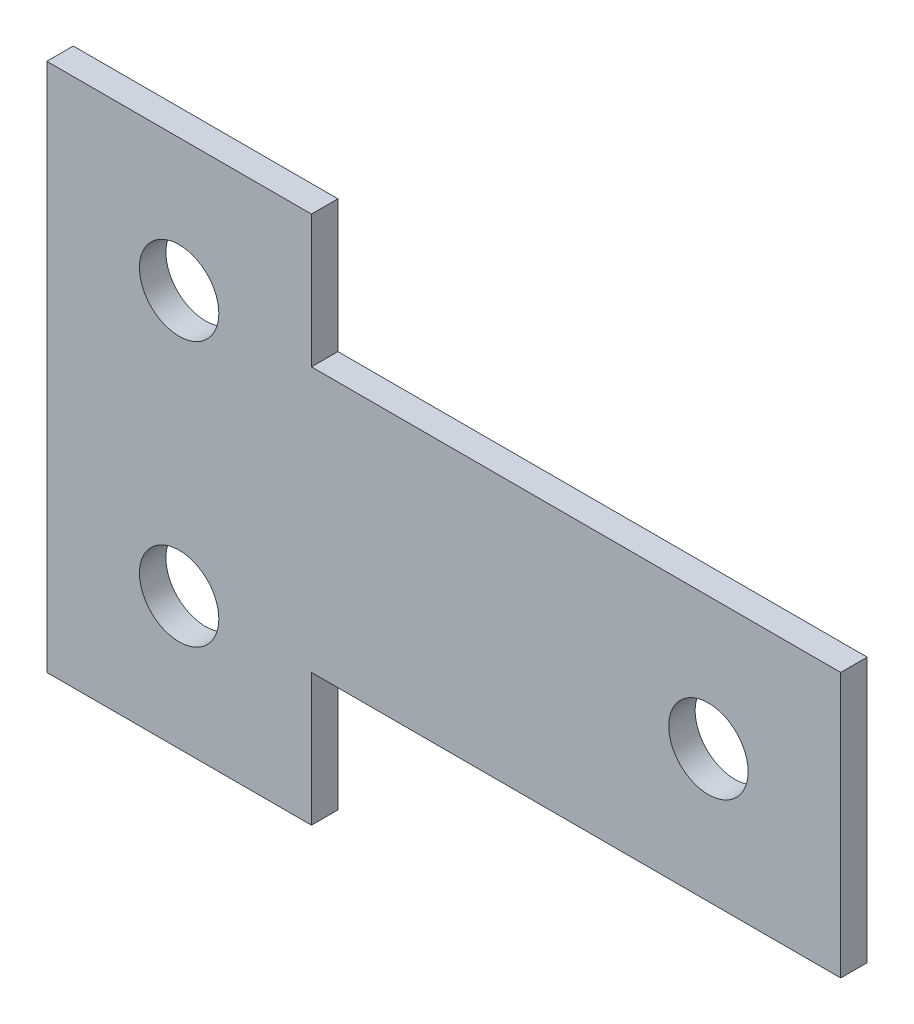
ISO-10303-21;
HEADER;
FILE_DESCRIPTION(('STEP AP214'),'2;1');
FILE_NAME('part.step','',(''),(''),'','','');
FILE_SCHEMA(('AUTOMOTIVE_DESIGN { 1 0 10303 214 1 1 1 1 }'));
ENDSEC;
DATA;
#1=APPLICATION_CONTEXT('core data for automotive mechanical design processes');
#2=APPLICATION_PROTOCOL_DEFINITION('international standard','automotive_design',2000,#1);
#3=PRODUCT_CONTEXT('',#1,'mechanical');
#4=PRODUCT('Part','Part','',(#3));
#5=PRODUCT_RELATED_PRODUCT_CATEGORY('part','',(#4));
#6=PRODUCT_DEFINITION_FORMATION('','',#4);
#7=PRODUCT_DEFINITION_CONTEXT('part definition',#1,'design');
#8=PRODUCT_DEFINITION('design','',#6,#7);
#9=PRODUCT_DEFINITION_SHAPE('','',#8);
#10=(LENGTH_UNIT() NAMED_UNIT(*) SI_UNIT(.MILLI.,.METRE.));
#11=(NAMED_UNIT(*) PLANE_ANGLE_UNIT() SI_UNIT($,.RADIAN.));
#12=(NAMED_UNIT(*) SI_UNIT($,.STERADIAN.) SOLID_ANGLE_UNIT());
#13=UNCERTAINTY_MEASURE_WITH_UNIT(LENGTH_MEASURE(1.E-05),#10,'distance_accuracy_value','');
#14=(GEOMETRIC_REPRESENTATION_CONTEXT(3) GLOBAL_UNCERTAINTY_ASSIGNED_CONTEXT((#13)) GLOBAL_UNIT_ASSIGNED_CONTEXT((#10,
#11,#12)) REPRESENTATION_CONTEXT('',''));
#15=CARTESIAN_POINT('',(0.,0.,0.));
#16=DIRECTION('',(0.,0.,1.));
#17=DIRECTION('',(1.,0.,0.));
#18=AXIS2_PLACEMENT_3D('',#15,#16,#17);
#19=CARTESIAN_POINT('',(0.564500484966157,0.,2.));
#20=DIRECTION('',(1.,0.,0.));
#21=DIRECTION('',(0.,1.,0.));
#22=AXIS2_PLACEMENT_3D('',#19,#20,#21);
#23=PLANE('',#22);
#24=DIRECTION('',(0.,-1.,0.));
#25=VECTOR('',#24,1.);
#26=CARTESIAN_POINT('',(0.564500484966157,0.,0.));
#27=LINE('',#26,#25);
#28=CARTESIAN_POINT('',(0.564500484966153,12.2,0.));
#29=VERTEX_POINT('',#28);
#30=CARTESIAN_POINT('',(0.56450048496616,-7.80000000000003,0.));
#31=VERTEX_POINT('',#30);
#32=EDGE_CURVE('E162',#29,#31,#27,.T.);
#33=ORIENTED_EDGE('',*,*,#32,.F.);
#34=DIRECTION('',(0.,0.,-1.));
#35=VECTOR('',#34,1.);
#36=CARTESIAN_POINT('',(0.564500484966153,12.2,2.));
#37=LINE('',#36,#35);
#38=CARTESIAN_POINT('',(0.564500484966153,12.2,2.));
#39=VERTEX_POINT('',#38);
#40=EDGE_CURVE('E11',#39,#29,#37,.T.);
#41=ORIENTED_EDGE('',*,*,#40,.F.);
#42=DIRECTION('',(0.,-1.,0.));
#43=VECTOR('',#42,1.);
#44=CARTESIAN_POINT('',(0.564500484966157,0.,2.));
#45=LINE('',#44,#43);
#46=CARTESIAN_POINT('',(0.56450048496616,-7.80000000000003,2.));
#47=VERTEX_POINT('',#46);
#48=EDGE_CURVE('E139',#39,#47,#45,.T.);
#49=ORIENTED_EDGE('',*,*,#48,.T.);
#50=DIRECTION('',(0.,0.,-1.));
#51=VECTOR('',#50,1.);
#52=CARTESIAN_POINT('',(0.56450048496616,-7.80000000000003,2.));
#53=LINE('',#52,#51);
#54=EDGE_CURVE('E87',#47,#31,#53,.T.);
#55=ORIENTED_EDGE('',*,*,#54,.T.);
#56=EDGE_LOOP('',(#33,#41,#49,#55));
#57=FACE_BOUND('',#56,.T.);
#58=ADVANCED_FACE('F37',(#57),#23,.T.);
#59=CARTESIAN_POINT('',(0.,12.2,2.));
#60=DIRECTION('',(0.,1.,0.));
#61=DIRECTION('',(0.,0.,1.));
#62=AXIS2_PLACEMENT_3D('',#59,#60,#61);
#63=PLANE('',#62);
#64=DIRECTION('',(1.,0.,0.));
#65=VECTOR('',#64,1.);
#66=CARTESIAN_POINT('',(0.,12.2,0.));
#67=LINE('',#66,#65);
#68=CARTESIAN_POINT('',(-39.4354995150338,12.2,0.));
#69=VERTEX_POINT('',#68);
#70=EDGE_CURVE('E166',#69,#29,#67,.T.);
#71=ORIENTED_EDGE('',*,*,#70,.F.);
#72=DIRECTION('',(0.,0.,-1.));
#73=VECTOR('',#72,1.);
#74=CARTESIAN_POINT('',(-39.4354995150338,12.2,2.));
#75=LINE('',#74,#73);
#76=CARTESIAN_POINT('',(-39.4354995150338,12.2,2.));
#77=VERTEX_POINT('',#76);
#78=EDGE_CURVE('E45',#77,#69,#75,.T.);
#79=ORIENTED_EDGE('',*,*,#78,.F.);
#80=DIRECTION('',(1.,0.,0.));
#81=VECTOR('',#80,1.);
#82=CARTESIAN_POINT('',(0.,12.2,2.));
#83=LINE('',#82,#81);
#84=EDGE_CURVE('E134',#77,#39,#83,.T.);
#85=ORIENTED_EDGE('',*,*,#84,.T.);
#86=ORIENTED_EDGE('',*,*,#40,.T.);
#87=EDGE_LOOP('',(#71,#79,#85,#86));
#88=FACE_BOUND('',#87,.T.);
#89=ADVANCED_FACE('F192',(#88),#63,.T.);
#90=CARTESIAN_POINT('',(-39.4354995150338,0.,2.));
#91=DIRECTION('',(1.,0.,0.));
#92=DIRECTION('',(0.,1.,0.));
#93=AXIS2_PLACEMENT_3D('',#90,#91,#92);
#94=PLANE('',#93);
#95=DIRECTION('',(0.,-1.,0.));
#96=VECTOR('',#95,1.);
#97=CARTESIAN_POINT('',(-39.4354995150338,0.,0.));
#98=LINE('',#97,#96);
#99=CARTESIAN_POINT('',(-39.4354995150339,22.2,0.));
#100=VERTEX_POINT('',#99);
#101=EDGE_CURVE('E170',#100,#69,#98,.T.);
#102=ORIENTED_EDGE('',*,*,#101,.F.);
#103=DIRECTION('',(0.,0.,-1.));
#104=VECTOR('',#103,1.);
#105=CARTESIAN_POINT('',(-39.4354995150339,22.2,2.));
#106=LINE('',#105,#104);
#107=CARTESIAN_POINT('',(-39.4354995150339,22.2,2.));
#108=VERTEX_POINT('',#107);
#109=EDGE_CURVE('E188',#108,#100,#106,.T.);
#110=ORIENTED_EDGE('',*,*,#109,.F.);
#111=DIRECTION('',(0.,-1.,0.));
#112=VECTOR('',#111,1.);
#113=CARTESIAN_POINT('',(-39.4354995150338,0.,2.));
#114=LINE('',#113,#112);
#115=EDGE_CURVE('E128',#108,#77,#114,.T.);
#116=ORIENTED_EDGE('',*,*,#115,.T.);
#117=ORIENTED_EDGE('',*,*,#78,.T.);
#118=EDGE_LOOP('',(#102,#110,#116,#117));
#119=FACE_BOUND('',#118,.T.);
#120=ADVANCED_FACE('F191',(#119),#94,.T.);
#121=CARTESIAN_POINT('',(0.,22.2,2.));
#122=DIRECTION('',(0.,1.,0.));
#123=DIRECTION('',(0.,0.,1.));
#124=AXIS2_PLACEMENT_3D('',#121,#122,#123);
#125=PLANE('',#124);
#126=DIRECTION('',(1.,0.,0.));
#127=VECTOR('',#126,1.);
#128=CARTESIAN_POINT('',(0.,22.2,0.));
#129=LINE('',#128,#127);
#130=CARTESIAN_POINT('',(-59.4354995150339,22.2,0.));
#131=VERTEX_POINT('',#130);
#132=EDGE_CURVE('E175',#131,#100,#129,.T.);
#133=ORIENTED_EDGE('',*,*,#132,.F.);
#134=DIRECTION('',(0.,0.,-1.));
#135=VECTOR('',#134,1.);
#136=CARTESIAN_POINT('',(-59.4354995150339,22.2,2.));
#137=LINE('',#136,#135);
#138=CARTESIAN_POINT('',(-59.4354995150339,22.2,2.));
#139=VERTEX_POINT('',#138);
#140=EDGE_CURVE('E186',#139,#131,#137,.T.);
#141=ORIENTED_EDGE('',*,*,#140,.F.);
#142=DIRECTION('',(1.,0.,0.));
#143=VECTOR('',#142,1.);
#144=CARTESIAN_POINT('',(0.,22.2,2.));
#145=LINE('',#144,#143);
#146=EDGE_CURVE('E133',#139,#108,#145,.T.);
#147=ORIENTED_EDGE('',*,*,#146,.T.);
#148=ORIENTED_EDGE('',*,*,#109,.T.);
#149=EDGE_LOOP('',(#133,#141,#147,#148));
#150=FACE_BOUND('',#149,.T.);
#151=ADVANCED_FACE('F197',(#150),#125,.T.);
#152=CARTESIAN_POINT('',(-59.4354995150338,0.,2.));
#153=DIRECTION('',(1.,0.,0.));
#154=DIRECTION('',(0.,1.,0.));
#155=AXIS2_PLACEMENT_3D('',#152,#153,#154);
#156=PLANE('',#155);
#157=DIRECTION('',(0.,-1.,0.));
#158=VECTOR('',#157,1.);
#159=CARTESIAN_POINT('',(-59.4354995150338,0.,0.));
#160=LINE('',#159,#158);
#161=CARTESIAN_POINT('',(-59.4354995150338,-17.8,0.));
#162=VERTEX_POINT('',#161);
#163=EDGE_CURVE('E179',#131,#162,#160,.T.);
#164=ORIENTED_EDGE('',*,*,#163,.T.);
#165=DIRECTION('',(0.,0.,-1.));
#166=VECTOR('',#165,1.);
#167=CARTESIAN_POINT('',(-59.4354995150338,-17.8,2.));
#168=LINE('',#167,#166);
#169=CARTESIAN_POINT('',(-59.4354995150338,-17.8,2.));
#170=VERTEX_POINT('',#169);
#171=EDGE_CURVE('E124',#170,#162,#168,.T.);
#172=ORIENTED_EDGE('',*,*,#171,.F.);
#173=DIRECTION('',(0.,-1.,0.));
#174=VECTOR('',#173,1.);
#175=CARTESIAN_POINT('',(-59.4354995150338,0.,2.));
#176=LINE('',#175,#174);
#177=EDGE_CURVE('E111',#139,#170,#176,.T.);
#178=ORIENTED_EDGE('',*,*,#177,.F.);
#179=ORIENTED_EDGE('',*,*,#140,.T.);
#180=EDGE_LOOP('',(#164,#172,#178,#179));
#181=FACE_BOUND('',#180,.T.);
#182=ADVANCED_FACE('F209',(#181),#156,.F.);
#183=CARTESIAN_POINT('',(0.,-17.8,2.));
#184=DIRECTION('',(0.,1.,0.));
#185=DIRECTION('',(0.,0.,1.));
#186=AXIS2_PLACEMENT_3D('',#183,#184,#185);
#187=PLANE('',#186);
#188=DIRECTION('',(1.,0.,0.));
#189=VECTOR('',#188,1.);
#190=CARTESIAN_POINT('',(0.,-17.8,0.));
#191=LINE('',#190,#189);
#192=CARTESIAN_POINT('',(-39.4354995150338,-17.8,0.));
#193=VERTEX_POINT('',#192);
#194=EDGE_CURVE('E120',#162,#193,#191,.T.);
#195=ORIENTED_EDGE('',*,*,#194,.T.);
#196=DIRECTION('',(0.,0.,-1.));
#197=VECTOR('',#196,1.);
#198=CARTESIAN_POINT('',(-39.4354995150338,-17.8,2.));
#199=LINE('',#198,#197);
#200=CARTESIAN_POINT('',(-39.4354995150338,-17.8,2.));
#201=VERTEX_POINT('',#200);
#202=EDGE_CURVE('E117',#201,#193,#199,.T.);
#203=ORIENTED_EDGE('',*,*,#202,.F.);
#204=DIRECTION('',(1.,0.,0.));
#205=VECTOR('',#204,1.);
#206=CARTESIAN_POINT('',(0.,-17.8,2.));
#207=LINE('',#206,#205);
#208=EDGE_CURVE('E104',#170,#201,#207,.T.);
#209=ORIENTED_EDGE('',*,*,#208,.F.);
#210=ORIENTED_EDGE('',*,*,#171,.T.);
#211=EDGE_LOOP('',(#195,#203,#209,#210));
#212=FACE_BOUND('',#211,.T.);
#213=ADVANCED_FACE('F118',(#212),#187,.F.);
#214=CARTESIAN_POINT('',(-39.4354995150338,-7.80000000000003,0.));
#215=VERTEX_POINT('',#214);
#216=EDGE_CURVE('E176',#215,#193,#98,.T.);
#217=ORIENTED_EDGE('',*,*,#216,.F.);
#218=DIRECTION('',(0.,0.,-1.));
#219=VECTOR('',#218,1.);
#220=CARTESIAN_POINT('',(-39.4354995150338,-7.80000000000003,2.));
#221=LINE('',#220,#219);
#222=CARTESIAN_POINT('',(-39.4354995150338,-7.80000000000003,2.));
#223=VERTEX_POINT('',#222);
#224=EDGE_CURVE('E80',#223,#215,#221,.T.);
#225=ORIENTED_EDGE('',*,*,#224,.F.);
#226=EDGE_CURVE('E108',#223,#201,#114,.T.);
#227=ORIENTED_EDGE('',*,*,#226,.T.);
#228=ORIENTED_EDGE('',*,*,#202,.T.);
#229=EDGE_LOOP('',(#217,#225,#227,#228));
#230=FACE_BOUND('',#229,.T.);
#231=ADVANCED_FACE('F126',(#230),#94,.T.);
#232=CARTESIAN_POINT('',(0.,-7.80000000000003,2.));
#233=DIRECTION('',(0.,1.,0.));
#234=DIRECTION('',(-1.,0.,0.));
#235=AXIS2_PLACEMENT_3D('',#232,#233,#234);
#236=PLANE('',#235);
#237=DIRECTION('',(1.,0.,0.));
#238=VECTOR('',#237,1.);
#239=CARTESIAN_POINT('',(0.,-7.80000000000003,0.));
#240=LINE('',#239,#238);
#241=EDGE_CURVE('E142',#215,#31,#240,.T.);
#242=ORIENTED_EDGE('',*,*,#241,.T.);
#243=ORIENTED_EDGE('',*,*,#54,.F.);
#244=DIRECTION('',(1.,0.,0.));
#245=VECTOR('',#244,1.);
#246=CARTESIAN_POINT('',(0.,-7.80000000000003,2.));
#247=LINE('',#246,#245);
#248=EDGE_CURVE('E53',#223,#47,#247,.T.);
#249=ORIENTED_EDGE('',*,*,#248,.F.);
#250=ORIENTED_EDGE('',*,*,#224,.T.);
#251=EDGE_LOOP('',(#242,#243,#249,#250));
#252=FACE_BOUND('',#251,.T.);
#253=ADVANCED_FACE('F216',(#252),#236,.F.);
#254=CARTESIAN_POINT('',(0.,0.,2.));
#255=DIRECTION('',(0.,0.,1.));
#256=DIRECTION('',(1.,0.,0.));
#257=AXIS2_PLACEMENT_3D('',#254,#255,#256);
#258=PLANE('',#257);
#259=CARTESIAN_POINT('',(-9.43549951503385,2.19999999999997,2.));
#260=DIRECTION('',(0.,0.,1.));
#261=DIRECTION('',(1.,0.,0.));
#262=AXIS2_PLACEMENT_3D('',#259,#260,#261);
#263=CIRCLE('',#262,3.);
#264=CARTESIAN_POINT('',(-6.43549951503385,2.19999999999997,2.));
#265=VERTEX_POINT('',#264);
#266=EDGE_CURVE('E157',#265,#265,#263,.T.);
#267=ORIENTED_EDGE('',*,*,#266,.F.);
#268=EDGE_LOOP('',(#267));
#269=FACE_BOUND('',#268,.T.);
#270=CARTESIAN_POINT('',(-49.4354995150338,12.2,2.));
#271=DIRECTION('',(0.,0.,1.));
#272=DIRECTION('',(1.,0.,0.));
#273=AXIS2_PLACEMENT_3D('',#270,#271,#272);
#274=CIRCLE('',#273,3.);
#275=CARTESIAN_POINT('',(-46.4354995150338,12.2,2.));
#276=VERTEX_POINT('',#275);
#277=EDGE_CURVE('E151',#276,#276,#274,.T.);
#278=ORIENTED_EDGE('',*,*,#277,.F.);
#279=EDGE_LOOP('',(#278));
#280=FACE_BOUND('',#279,.T.);
#281=CARTESIAN_POINT('',(-49.4354995150339,-7.80000000000003,2.));
#282=DIRECTION('',(0.,0.,1.));
#283=DIRECTION('',(1.,0.,0.));
#284=AXIS2_PLACEMENT_3D('',#281,#282,#283);
#285=CIRCLE('',#284,3.);
#286=CARTESIAN_POINT('',(-46.4354995150339,-7.80000000000003,2.));
#287=VERTEX_POINT('',#286);
#288=EDGE_CURVE('E145',#287,#287,#285,.T.);
#289=ORIENTED_EDGE('',*,*,#288,.F.);
#290=EDGE_LOOP('',(#289));
#291=FACE_BOUND('',#290,.T.);
#292=ORIENTED_EDGE('',*,*,#48,.F.);
#293=ORIENTED_EDGE('',*,*,#84,.F.);
#294=ORIENTED_EDGE('',*,*,#115,.F.);
#295=ORIENTED_EDGE('',*,*,#146,.F.);
#296=ORIENTED_EDGE('',*,*,#177,.T.);
#297=ORIENTED_EDGE('',*,*,#208,.T.);
#298=ORIENTED_EDGE('',*,*,#226,.F.);
#299=ORIENTED_EDGE('',*,*,#248,.T.);
#300=EDGE_LOOP('',(#292,#293,#294,#295,#296,#297,#298,#299));
#301=FACE_BOUND('',#300,.T.);
#302=ADVANCED_FACE('F106',(#269,#280,#291,#301),#258,.T.);
#303=CARTESIAN_POINT('',(0.,0.,0.));
#304=DIRECTION('',(0.,0.,1.));
#305=DIRECTION('',(1.,0.,0.));
#306=AXIS2_PLACEMENT_3D('',#303,#304,#305);
#307=PLANE('',#306);
#308=CARTESIAN_POINT('',(-9.43549951503385,2.19999999999997,0.));
#309=DIRECTION('',(0.,0.,1.));
#310=DIRECTION('',(1.,0.,0.));
#311=AXIS2_PLACEMENT_3D('',#308,#309,#310);
#312=CIRCLE('',#311,3.);
#313=CARTESIAN_POINT('',(-6.43549951503385,2.19999999999997,0.));
#314=VERTEX_POINT('',#313);
#315=EDGE_CURVE('E160',#314,#314,#312,.T.);
#316=ORIENTED_EDGE('',*,*,#315,.T.);
#317=EDGE_LOOP('',(#316));
#318=FACE_BOUND('',#317,.T.);
#319=CARTESIAN_POINT('',(-49.4354995150338,12.2,0.));
#320=DIRECTION('',(0.,0.,1.));
#321=DIRECTION('',(1.,0.,0.));
#322=AXIS2_PLACEMENT_3D('',#319,#320,#321);
#323=CIRCLE('',#322,3.);
#324=CARTESIAN_POINT('',(-46.4354995150338,12.2,0.));
#325=VERTEX_POINT('',#324);
#326=EDGE_CURVE('E154',#325,#325,#323,.T.);
#327=ORIENTED_EDGE('',*,*,#326,.T.);
#328=EDGE_LOOP('',(#327));
#329=FACE_BOUND('',#328,.T.);
#330=CARTESIAN_POINT('',(-49.4354995150339,-7.80000000000003,0.));
#331=DIRECTION('',(0.,0.,1.));
#332=DIRECTION('',(1.,0.,0.));
#333=AXIS2_PLACEMENT_3D('',#330,#331,#332);
#334=CIRCLE('',#333,3.);
#335=CARTESIAN_POINT('',(-46.4354995150339,-7.80000000000003,0.));
#336=VERTEX_POINT('',#335);
#337=EDGE_CURVE('E148',#336,#336,#334,.T.);
#338=ORIENTED_EDGE('',*,*,#337,.T.);
#339=EDGE_LOOP('',(#338));
#340=FACE_BOUND('',#339,.T.);
#341=ORIENTED_EDGE('',*,*,#32,.T.);
#342=ORIENTED_EDGE('',*,*,#241,.F.);
#343=ORIENTED_EDGE('',*,*,#216,.T.);
#344=ORIENTED_EDGE('',*,*,#194,.F.);
#345=ORIENTED_EDGE('',*,*,#163,.F.);
#346=ORIENTED_EDGE('',*,*,#132,.T.);
#347=ORIENTED_EDGE('',*,*,#101,.T.);
#348=ORIENTED_EDGE('',*,*,#70,.T.);
#349=EDGE_LOOP('',(#341,#342,#343,#344,#345,#346,#347,#348));
#350=FACE_BOUND('',#349,.T.);
#351=ADVANCED_FACE('F193',(#318,#329,#340,#350),#307,.F.);
#352=CARTESIAN_POINT('',(-49.4354995150339,-7.80000000000003,0.));
#353=DIRECTION('',(0.,0.,1.));
#354=DIRECTION('',(1.,0.,0.));
#355=AXIS2_PLACEMENT_3D('',#352,#353,#354);
#356=CYLINDRICAL_SURFACE('',#355,3.);
#357=ORIENTED_EDGE('',*,*,#337,.F.);
#358=EDGE_LOOP('',(#357));
#359=FACE_BOUND('',#358,.T.);
#360=ORIENTED_EDGE('',*,*,#288,.T.);
#361=EDGE_LOOP('',(#360));
#362=FACE_BOUND('',#361,.T.);
#363=ADVANCED_FACE('F221',(#359,#362),#356,.F.);
#364=CARTESIAN_POINT('',(-49.4354995150338,12.2,0.));
#365=DIRECTION('',(0.,0.,1.));
#366=DIRECTION('',(1.,0.,0.));
#367=AXIS2_PLACEMENT_3D('',#364,#365,#366);
#368=CYLINDRICAL_SURFACE('',#367,3.);
#369=ORIENTED_EDGE('',*,*,#326,.F.);
#370=EDGE_LOOP('',(#369));
#371=FACE_BOUND('',#370,.T.);
#372=ORIENTED_EDGE('',*,*,#277,.T.);
#373=EDGE_LOOP('',(#372));
#374=FACE_BOUND('',#373,.T.);
#375=ADVANCED_FACE('F227',(#371,#374),#368,.F.);
#376=CARTESIAN_POINT('',(-9.43549951503385,2.19999999999997,0.));
#377=DIRECTION('',(0.,0.,1.));
#378=DIRECTION('',(1.,0.,0.));
#379=AXIS2_PLACEMENT_3D('',#376,#377,#378);
#380=CYLINDRICAL_SURFACE('',#379,3.);
#381=ORIENTED_EDGE('',*,*,#315,.F.);
#382=EDGE_LOOP('',(#381));
#383=FACE_BOUND('',#382,.T.);
#384=ORIENTED_EDGE('',*,*,#266,.T.);
#385=EDGE_LOOP('',(#384));
#386=FACE_BOUND('',#385,.T.);
#387=ADVANCED_FACE('F231',(#383,#386),#380,.F.);
#388=CLOSED_SHELL('',(#58,#89,#120,#151,#182,#213,#231,#253,#302,#351,#363,#375,#387));
#389=MANIFOLD_SOLID_BREP('B2',#388);
#390=ADVANCED_BREP_SHAPE_REPRESENTATION('',(#18,#389),#14);
#391=SHAPE_DEFINITION_REPRESENTATION(#9,#390);
ENDSEC;
END-ISO-10303-21;
